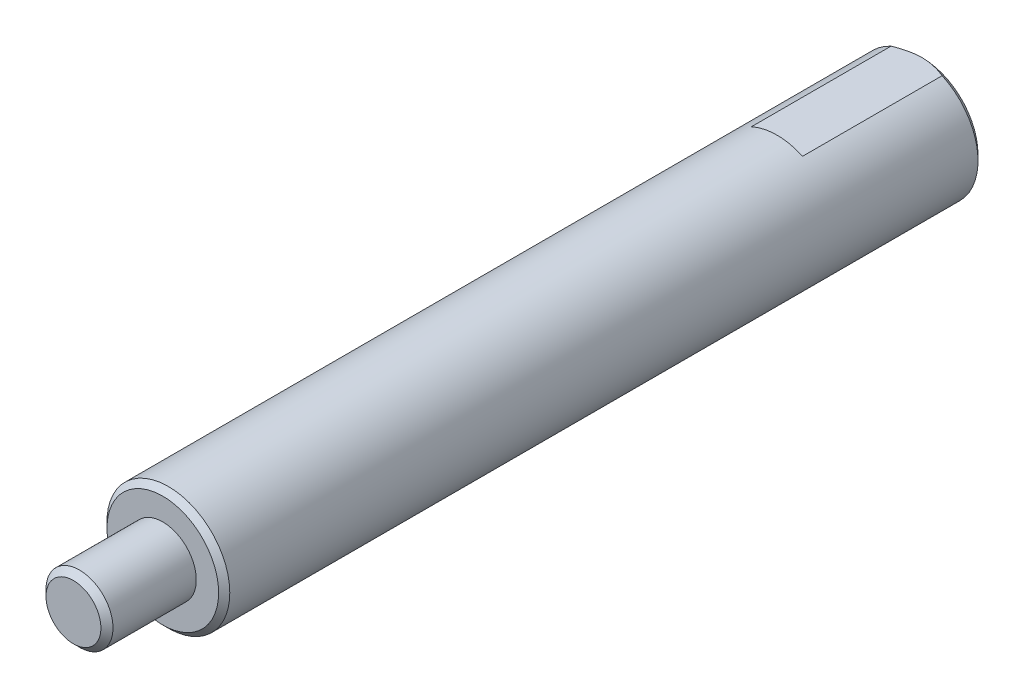
ISO-10303-21;
HEADER;
FILE_DESCRIPTION(('STEP AP214'),'2;1');
FILE_NAME('part.step','',(''),(''),'','','');
FILE_SCHEMA(('AUTOMOTIVE_DESIGN { 1 0 10303 214 1 1 1 1 }'));
ENDSEC;
DATA;
#1=APPLICATION_CONTEXT('core data for automotive mechanical design processes');
#2=APPLICATION_PROTOCOL_DEFINITION('international standard','automotive_design',2000,#1);
#3=PRODUCT_CONTEXT('',#1,'mechanical');
#4=PRODUCT('Part','Part','',(#3));
#5=PRODUCT_RELATED_PRODUCT_CATEGORY('part','',(#4));
#6=PRODUCT_DEFINITION_FORMATION('','',#4);
#7=PRODUCT_DEFINITION_CONTEXT('part definition',#1,'design');
#8=PRODUCT_DEFINITION('design','',#6,#7);
#9=PRODUCT_DEFINITION_SHAPE('','',#8);
#10=(LENGTH_UNIT() NAMED_UNIT(*) SI_UNIT(.MILLI.,.METRE.));
#11=(NAMED_UNIT(*) PLANE_ANGLE_UNIT() SI_UNIT($,.RADIAN.));
#12=(NAMED_UNIT(*) SI_UNIT($,.STERADIAN.) SOLID_ANGLE_UNIT());
#13=UNCERTAINTY_MEASURE_WITH_UNIT(LENGTH_MEASURE(1.E-05),#10,'distance_accuracy_value','');
#14=(GEOMETRIC_REPRESENTATION_CONTEXT(3) GLOBAL_UNCERTAINTY_ASSIGNED_CONTEXT((#13)) GLOBAL_UNIT_ASSIGNED_CONTEXT((#10,
#11,#12)) REPRESENTATION_CONTEXT('',''));
#15=CARTESIAN_POINT('',(0.,0.,0.));
#16=DIRECTION('',(0.,0.,1.));
#17=DIRECTION('',(1.,0.,0.));
#18=AXIS2_PLACEMENT_3D('',#15,#16,#17);
#19=CARTESIAN_POINT('',(0.,0.,0.5));
#20=DIRECTION('',(0.,0.,1.));
#21=DIRECTION('',(1.,0.,0.));
#22=AXIS2_PLACEMENT_3D('',#19,#20,#21);
#23=CONICAL_SURFACE('',#22,5.5,0.785398163397457);
#24=CARTESIAN_POINT('',(14.6848091307527,5.,10.5126921972504));
#25=CARTESIAN_POINT('',(14.4453208226169,5.,10.2859896541326));
#26=CARTESIAN_POINT('',(14.2055496886512,5.,10.0595855916861));
#27=CARTESIAN_POINT('',(13.7253433237667,5.,9.60748006149906));
#28=CARTESIAN_POINT('',(13.4849080888775,5.,9.38177859797622));
#29=CARTESIAN_POINT('',(12.7618962256916,5.,8.70536049882658));
#30=CARTESIAN_POINT('',(12.2781765081116,5.,8.25586410270802));
#31=CARTESIAN_POINT('',(11.285520275484,5.,7.34194274282295));
#32=CARTESIAN_POINT('',(10.7764003173808,5.,6.87771631839147));
#33=CARTESIAN_POINT('',(10.0081237078526,5.,6.18705169530893));
#34=CARTESIAN_POINT('',(9.75140731219676,5.,5.95789999795166));
#35=CARTESIAN_POINT('',(9.23598125315539,5.,5.50185127115898));
#36=CARTESIAN_POINT('',(8.97727160895973,5.,5.27495422006515));
#37=CARTESIAN_POINT('',(8.45777334373333,5.,4.82431921159364));
#38=CARTESIAN_POINT('',(8.19698831207968,5.,4.60057712329841));
#39=CARTESIAN_POINT('',(7.6723358301828,5.,4.15670009726197));
#40=CARTESIAN_POINT('',(7.4084682157494,5.,3.93656535317604));
#41=CARTESIAN_POINT('',(6.87588577364976,5.,3.50025684420232));
#42=CARTESIAN_POINT('',(6.60715699098736,5.,3.28410005066106));
#43=CARTESIAN_POINT('',(6.06467897085506,5.,2.85824880719012));
#44=CARTESIAN_POINT('',(5.79093054202075,5.,2.64855333071791));
#45=CARTESIAN_POINT('',(5.24247824545979,5.,2.24225256251792));
#46=CARTESIAN_POINT('',(4.96790940819435,5.,2.04546689887257));
#47=CARTESIAN_POINT('',(4.54965992503172,5.,1.7593740597509));
#48=CARTESIAN_POINT('',(4.40911425501469,5.,1.66548481679897));
#49=CARTESIAN_POINT('',(4.12560555295639,5.,1.48143277641831));
#50=CARTESIAN_POINT('',(3.98264266122826,5.,1.39126976373138));
#51=CARTESIAN_POINT('',(3.69483138879447,5.,1.21601413329321));
#52=CARTESIAN_POINT('',(3.54999993591857,5.,1.13089382459595));
#53=CARTESIAN_POINT('',(3.25720950323672,5.,0.96613475049896));
#54=CARTESIAN_POINT('',(3.10925012756169,5.,0.886496684424973));
#55=CARTESIAN_POINT('',(2.81011276522673,5.,0.734125373534712));
#56=CARTESIAN_POINT('',(2.65894061859038,5.,0.661380726321601));
#57=CARTESIAN_POINT('',(2.35286256329051,5.,0.524242686166179));
#58=CARTESIAN_POINT('',(2.19795788752428,5.,0.459846579258794));
#59=CARTESIAN_POINT('',(1.96757107505026,5.,0.372774300731281));
#60=CARTESIAN_POINT('',(1.89359074216658,5.,0.346101437024846));
#61=CARTESIAN_POINT('',(1.74478391072042,5.,0.295222264195086));
#62=CARTESIAN_POINT('',(1.66995737392907,5.,0.271016067006701));
#63=CARTESIAN_POINT('',(1.44419485912727,5.,0.202417832217193));
#64=CARTESIAN_POINT('',(1.29200049197909,5.,0.162055560028204));
#65=CARTESIAN_POINT('',(0.985646477349276,5.,0.0940487123556825));
#66=CARTESIAN_POINT('',(0.831502220582615,5.,0.0663354854095938));
#67=CARTESIAN_POINT('',(0.521341182896939,5.,0.0247588689838233));
#68=CARTESIAN_POINT('',(0.365324622092967,5.,0.0108938672889534));
#69=CARTESIAN_POINT('',(0.0516160098073081,5.,-0.00220571628048262));
#70=CARTESIAN_POINT('',(-0.106080254029489,5.,-0.00134130349865995));
#71=CARTESIAN_POINT('',(-0.420679844238093,5.,0.015205502727523));
#72=CARTESIAN_POINT('',(-0.577583163483296,5.,0.0308880291126693));
#73=CARTESIAN_POINT('',(-0.890071145811355,5.,0.0762385891218637));
#74=CARTESIAN_POINT('',(-1.04564624986807,5.,0.105971488681488));
#75=CARTESIAN_POINT('',(-1.35387421816574,5.,0.177884717281074));
#76=CARTESIAN_POINT('',(-1.50652647420601,5.,0.220067607636138));
#77=CARTESIAN_POINT('',(-1.89899228144063,5.,0.343556358459226));
#78=CARTESIAN_POINT('',(-2.13618939052799,5.,0.433155135839447));
#79=CARTESIAN_POINT('',(-2.6019239710927,5.,0.632544932175611));
#80=CARTESIAN_POINT('',(-2.83045405488705,5.,0.742352730382571));
#81=CARTESIAN_POINT('',(-3.16847602424751,5.,0.918609391765351));
#82=CARTESIAN_POINT('',(-3.2808721724946,5.,0.979600606049572));
#83=CARTESIAN_POINT('',(-3.50386518493618,5.,1.10479681410015));
#84=CARTESIAN_POINT('',(-3.61446202600304,5.,1.16900184913261));
#85=CARTESIAN_POINT('',(-3.83396126584146,5.,1.30012039469583));
#86=CARTESIAN_POINT('',(-3.94286443721393,5.,1.36703261693928));
#87=CARTESIAN_POINT('',(-4.15918024646913,5.,1.50320934076179));
#88=CARTESIAN_POINT('',(-4.26659294268127,5.,1.57247374992073));
#89=CARTESIAN_POINT('',(-4.62241235734337,5.,1.80671898738903));
#90=CARTESIAN_POINT('',(-4.8678658700884,5.,1.97619150842323));
#91=CARTESIAN_POINT('',(-5.35312692377588,5.,2.32306349681903));
#92=CARTESIAN_POINT('',(-5.5929332207239,5.,2.50046468625888));
#93=CARTESIAN_POINT('',(-6.06824445724728,5.,2.86127560728381));
#94=CARTESIAN_POINT('',(-6.30374612411163,5.,3.04468963665758));
#95=CARTESIAN_POINT('',(-6.77116765089348,5.,3.41597165684284));
#96=CARTESIAN_POINT('',(-7.00308779793956,5.,3.603839287518));
#97=CARTESIAN_POINT('',(-7.46479831203303,5.,3.98364854892032));
#98=CARTESIAN_POINT('',(-7.69457957218859,5.,4.17560122632358));
#99=CARTESIAN_POINT('',(-8.15180534086184,5.,4.56227258082269));
#100=CARTESIAN_POINT('',(-8.37924980937898,5.,4.7569913051315));
#101=CARTESIAN_POINT('',(-8.83212152767335,5.,5.14856830192789));
#102=CARTESIAN_POINT('',(-9.05754957794687,5.,5.34542564979244));
#103=CARTESIAN_POINT('',(-9.50680949169888,5.,5.74095449633208));
#104=CARTESIAN_POINT('',(-9.73064134364113,5.,5.93962600809511));
#105=CARTESIAN_POINT('',(-10.3554269609871,5.,6.49792304019967));
#106=CARTESIAN_POINT('',(-10.7548894567921,5.,6.85921712232008));
#107=CARTESIAN_POINT('',(-11.5506520435192,5.,7.58535654201278));
#108=CARTESIAN_POINT('',(-11.9469517546505,5.,7.95020229473568));
#109=CARTESIAN_POINT('',(-12.7346046209229,5.,8.6802168794551));
#110=CARTESIAN_POINT('',(-13.1259732089033,5.,9.04536907885113));
#111=CARTESIAN_POINT('',(-13.9067337252459,5.,9.77766414097997));
#112=CARTESIAN_POINT('',(-14.2961259422761,5.,10.1448066957958));
#113=CARTESIAN_POINT('',(-14.6848091307527,5.,10.5126921972504));
#114=B_SPLINE_CURVE_WITH_KNOTS('',3,(#24,#25,#26,#27,#28,#29,#30,#31,#32,#33,#34,#35,#36,#37,
#38,#39,#40,#41,#42,#43,#44,#45,#46,#47,#48,#49,#50,#51,#52,#53,#54,#55,#56,#57,#58,#59,#60,#61,
#62,#63,#64,#65,#66,#67,#68,#69,#70,#71,#72,#73,#74,#75,#76,#77,#78,#79,#80,#81,#82,#83,#84,#85,
#86,#87,#88,#89,#90,#91,#92,#93,#94,#95,#96,#97,#98,#99,#100,#101,#102,#103,#104,#105,#106,#107,
#108,#109,#110,#111,#112,#113),.UNSPECIFIED.,.F.,.F.,(4,2,2,2,2,2,2,2,2,2,2,2,2,2,2,2,2,2,2,2,2,
2,2,2,2,2,2,2,2,2,2,2,2,2,2,2,2,2,2,2,2,2,2,2,4),(0.,0.989311923310725,1.97862977419094,
3.95959337600449,6.02651317448664,7.05884240046679,8.09116170015323,9.12197286482435,
10.1528391870695,11.1873903696084,12.2217763312281,13.2349233326135,13.7419424161501,
14.2489321689687,14.7528143978999,15.2567607843972,15.7598584856993,16.2627922263957,
16.4986794127495,16.7345772986731,17.2064516788898,17.6757336299656,18.1449609407033,
18.6173431093421,19.0897295160002,19.5643184047905,20.0390049980712,20.798297788604,
21.5582238763949,21.9418160729224,22.325413196115,22.7088298733657,23.0922315031285,
23.9868071792125,24.8815781072262,25.7770031658052,26.6723560620085,27.5705534283766,
28.4687661443111,29.3666048627684,30.2644500636282,31.8802558929104,33.4962529155446,
35.1020309687601,36.707567313143),.UNSPECIFIED.);
#115=CARTESIAN_POINT('',(2.29128784747799,5.,0.499999999999981));
#116=VERTEX_POINT('',#115);
#117=CARTESIAN_POINT('',(0.,4.99999999999999,0.));
#118=VERTEX_POINT('',#117);
#119=EDGE_CURVE('E54',#116,#118,#114,.T.);
#120=ORIENTED_EDGE('',*,*,#119,.F.);
#121=CARTESIAN_POINT('',(0.,0.,0.5));
#122=DIRECTION('',(0.,0.,1.));
#123=DIRECTION('',(1.,0.,0.));
#124=AXIS2_PLACEMENT_3D('',#121,#122,#123);
#125=CIRCLE('',#124,5.5);
#126=CARTESIAN_POINT('',(2.29128784747792,-5.,0.5));
#127=VERTEX_POINT('',#126);
#128=EDGE_CURVE('E123',#127,#116,#125,.T.);
#129=ORIENTED_EDGE('',*,*,#128,.F.);
#130=CARTESIAN_POINT('',(-14.6848091307527,-5.,10.5126921972504));
#131=CARTESIAN_POINT('',(-14.4453208226169,-5.,10.2859896541325));
#132=CARTESIAN_POINT('',(-14.2055496886512,-5.,10.0595855916861));
#133=CARTESIAN_POINT('',(-13.7253433237667,-5.,9.60748006149906));
#134=CARTESIAN_POINT('',(-13.4849080888775,-5.,9.38177859797621));
#135=CARTESIAN_POINT('',(-12.7618962256916,-5.,8.70536049882658));
#136=CARTESIAN_POINT('',(-12.2781765081116,-5.,8.25586410270802));
#137=CARTESIAN_POINT('',(-11.285520275484,-5.,7.34194274282294));
#138=CARTESIAN_POINT('',(-10.7764003173808,-5.,6.87771631839147));
#139=CARTESIAN_POINT('',(-10.0081237078526,-5.,6.18705169530893));
#140=CARTESIAN_POINT('',(-9.75140731219676,-5.,5.95789999795166));
#141=CARTESIAN_POINT('',(-9.23598125315539,-5.,5.50185127115898));
#142=CARTESIAN_POINT('',(-8.97727160895972,-5.,5.27495422006515));
#143=CARTESIAN_POINT('',(-8.45777334373333,-5.,4.82431921159363));
#144=CARTESIAN_POINT('',(-8.19698831207968,-5.,4.60057712329841));
#145=CARTESIAN_POINT('',(-7.67233583018279,-5.,4.15670009726197));
#146=CARTESIAN_POINT('',(-7.4084682157494,-5.,3.93656535317604));
#147=CARTESIAN_POINT('',(-6.87588577364976,-5.,3.50025684420232));
#148=CARTESIAN_POINT('',(-6.60715699098736,-5.,3.28410005066106));
#149=CARTESIAN_POINT('',(-6.06467897085506,-5.,2.85824880719012));
#150=CARTESIAN_POINT('',(-5.79093054202075,-5.,2.64855333071791));
#151=CARTESIAN_POINT('',(-5.24247824545979,-5.,2.24225256251792));
#152=CARTESIAN_POINT('',(-4.96790940819436,-5.,2.04546689887257));
#153=CARTESIAN_POINT('',(-4.54965992503172,-5.,1.7593740597509));
#154=CARTESIAN_POINT('',(-4.40911425501469,-5.,1.66548481679897));
#155=CARTESIAN_POINT('',(-4.12560555295639,-5.,1.48143277641831));
#156=CARTESIAN_POINT('',(-3.98264266122826,-5.,1.39126976373138));
#157=CARTESIAN_POINT('',(-3.69483138879447,-5.,1.21601413329321));
#158=CARTESIAN_POINT('',(-3.54999993591857,-5.,1.13089382459595));
#159=CARTESIAN_POINT('',(-3.25720950323672,-5.,0.96613475049896));
#160=CARTESIAN_POINT('',(-3.10925012756169,-5.,0.886496684424973));
#161=CARTESIAN_POINT('',(-2.81011276522673,-5.,0.734125373534712));
#162=CARTESIAN_POINT('',(-2.65894061859038,-5.,0.661380726321601));
#163=CARTESIAN_POINT('',(-2.35286256329051,-5.,0.524242686166179));
#164=CARTESIAN_POINT('',(-2.19795788752428,-5.,0.459846579258795));
#165=CARTESIAN_POINT('',(-1.96757107505027,-5.,0.372774300731282));
#166=CARTESIAN_POINT('',(-1.89359074216658,-5.,0.346101437024846));
#167=CARTESIAN_POINT('',(-1.74478391072042,-5.,0.295222264195086));
#168=CARTESIAN_POINT('',(-1.66995737392907,-5.,0.271016067006701));
#169=CARTESIAN_POINT('',(-1.44419485912727,-5.,0.202417832217193));
#170=CARTESIAN_POINT('',(-1.29200049197909,-5.,0.162055560028204));
#171=CARTESIAN_POINT('',(-0.985646477349277,-5.,0.0940487123556828));
#172=CARTESIAN_POINT('',(-0.831502220582616,-5.,0.0663354854095948));
#173=CARTESIAN_POINT('',(-0.52134118289694,-5.,0.0247588689838242));
#174=CARTESIAN_POINT('',(-0.365324622092969,-5.,0.0108938672889537));
#175=CARTESIAN_POINT('',(-0.0516160098073107,-5.,-0.00220571628048288));
#176=CARTESIAN_POINT('',(0.106080254029486,-5.,-0.00134130349866004));
#177=CARTESIAN_POINT('',(0.42067984423809,-5.,0.0152055027275231));
#178=CARTESIAN_POINT('',(0.577583163483293,-5.,0.0308880291126695));
#179=CARTESIAN_POINT('',(0.890071145811352,-5.,0.0762385891218634));
#180=CARTESIAN_POINT('',(1.04564624986807,-5.,0.105971488681487));
#181=CARTESIAN_POINT('',(1.35387421816574,-5.,0.177884717281073));
#182=CARTESIAN_POINT('',(1.50652647420601,-5.,0.220067607636137));
#183=CARTESIAN_POINT('',(1.89899228144063,-5.,0.343556358459226));
#184=CARTESIAN_POINT('',(2.13618939052798,-5.,0.433155135839446));
#185=CARTESIAN_POINT('',(2.60192397109269,-5.,0.632544932175609));
#186=CARTESIAN_POINT('',(2.83045405488705,-5.,0.742352730382567));
#187=CARTESIAN_POINT('',(3.1684760242475,-5.,0.918609391765348));
#188=CARTESIAN_POINT('',(3.28087217249459,-5.,0.97960060604957));
#189=CARTESIAN_POINT('',(3.50386518493617,-5.,1.10479681410015));
#190=CARTESIAN_POINT('',(3.61446202600303,-5.,1.16900184913261));
#191=CARTESIAN_POINT('',(3.83396126584145,-5.,1.30012039469583));
#192=CARTESIAN_POINT('',(3.94286443721392,-5.,1.36703261693928));
#193=CARTESIAN_POINT('',(4.15918024646912,-5.,1.50320934076178));
#194=CARTESIAN_POINT('',(4.26659294268127,-5.,1.57247374992073));
#195=CARTESIAN_POINT('',(4.62241235734336,-5.,1.80671898738902));
#196=CARTESIAN_POINT('',(4.86786587008839,-5.,1.97619150842322));
#197=CARTESIAN_POINT('',(5.35312692377587,-5.,2.32306349681902));
#198=CARTESIAN_POINT('',(5.59293322072389,-5.,2.50046468625887));
#199=CARTESIAN_POINT('',(6.06824445724727,-5.,2.86127560728381));
#200=CARTESIAN_POINT('',(6.30374612411162,-5.,3.04468963665757));
#201=CARTESIAN_POINT('',(6.77116765089347,-5.,3.41597165684283));
#202=CARTESIAN_POINT('',(7.00308779793955,-5.,3.60383928751799));
#203=CARTESIAN_POINT('',(7.46479831203302,-5.,3.98364854892032));
#204=CARTESIAN_POINT('',(7.69457957218858,-5.,4.17560122632357));
#205=CARTESIAN_POINT('',(8.15180534086183,-5.,4.56227258082269));
#206=CARTESIAN_POINT('',(8.37924980937897,-5.,4.75699130513149));
#207=CARTESIAN_POINT('',(8.83212152767334,-5.,5.14856830192789));
#208=CARTESIAN_POINT('',(9.05754957794686,-5.,5.34542564979243));
#209=CARTESIAN_POINT('',(9.50680949169887,-5.,5.74095449633208));
#210=CARTESIAN_POINT('',(9.73064134364113,-5.,5.9396260080951));
#211=CARTESIAN_POINT('',(10.355426960987,-5.,6.49792304019967));
#212=CARTESIAN_POINT('',(10.7548894567921,-5.,6.85921712232007));
#213=CARTESIAN_POINT('',(11.5506520435192,-5.,7.58535654201278));
#214=CARTESIAN_POINT('',(11.9469517546505,-5.,7.95020229473567));
#215=CARTESIAN_POINT('',(12.7346046209229,-5.,8.6802168794551));
#216=CARTESIAN_POINT('',(13.1259732089033,-5.,9.04536907885113));
#217=CARTESIAN_POINT('',(13.9067337252459,-5.,9.77766414097997));
#218=CARTESIAN_POINT('',(14.2961259422761,-5.,10.1448066957958));
#219=CARTESIAN_POINT('',(14.6848091307527,-5.,10.5126921972504));
#220=B_SPLINE_CURVE_WITH_KNOTS('',3,(#130,#131,#132,#133,#134,#135,#136,#137,#138,#139,#140,
#141,#142,#143,#144,#145,#146,#147,#148,#149,#150,#151,#152,#153,#154,#155,#156,#157,#158,#159,
#160,#161,#162,#163,#164,#165,#166,#167,#168,#169,#170,#171,#172,#173,#174,#175,#176,#177,#178,
#179,#180,#181,#182,#183,#184,#185,#186,#187,#188,#189,#190,#191,#192,#193,#194,#195,#196,#197,
#198,#199,#200,#201,#202,#203,#204,#205,#206,#207,#208,#209,#210,#211,#212,#213,#214,#215,#216,
#217,#218,#219),.UNSPECIFIED.,.F.,.F.,(4,2,2,2,2,2,2,2,2,2,2,2,2,2,2,2,2,2,2,2,2,2,2,2,2,2,2,2,
2,2,2,2,2,2,2,2,2,2,2,2,2,2,2,2,4),(0.,0.989311923310724,1.97862977419094,3.95959337600449,
6.02651317448663,7.05884240046678,8.09116170015323,9.12197286482434,10.1528391870695,
11.1873903696084,12.2217763312281,13.2349233326135,13.7419424161501,14.2489321689687,
14.7528143978999,15.2567607843972,15.7598584856993,16.2627922263957,16.4986794127495,
16.7345772986731,17.2064516788898,17.6757336299656,18.1449609407033,18.6173431093421,
19.0897295160002,19.5643184047905,20.0390049980712,20.798297788604,21.5582238763948,
21.9418160729224,22.325413196115,22.7088298733657,23.0922315031285,23.9868071792125,
24.8815781072262,25.7770031658052,26.6723560620085,27.5705534283765,28.468766144311,
29.3666048627684,30.2644500636281,31.8802558929104,33.4962529155446,35.10203096876,
36.7075673131429),.UNSPECIFIED.);
#221=CARTESIAN_POINT('',(0.,-4.99999999999999,0.));
#222=VERTEX_POINT('',#221);
#223=EDGE_CURVE('E139',#222,#127,#220,.T.);
#224=ORIENTED_EDGE('',*,*,#223,.F.);
#225=CARTESIAN_POINT('',(0.,0.,0.));
#226=DIRECTION('',(0.,0.,1.));
#227=DIRECTION('',(1.,0.,0.));
#228=AXIS2_PLACEMENT_3D('',#225,#226,#227);
#229=CIRCLE('',#228,4.99999999999999);
#230=EDGE_CURVE('E130',#118,#222,#229,.F.);
#231=ORIENTED_EDGE('',*,*,#230,.F.);
#232=EDGE_LOOP('',(#120,#129,#224,#231));
#233=FACE_BOUND('',#232,.T.);
#234=ADVANCED_FACE('F39',(#233),#23,.T.);
#235=CARTESIAN_POINT('',(0.,0.,68.));
#236=DIRECTION('',(0.,0.,1.));
#237=DIRECTION('',(1.,0.,0.));
#238=AXIS2_PLACEMENT_3D('',#235,#236,#237);
#239=PLANE('',#238);
#240=CARTESIAN_POINT('',(0.,0.,68.));
#241=DIRECTION('',(0.,0.,1.));
#242=DIRECTION('',(1.,0.,0.));
#243=AXIS2_PLACEMENT_3D('',#240,#241,#242);
#244=CIRCLE('',#243,5.);
#245=CARTESIAN_POINT('',(5.,0.,68.));
#246=VERTEX_POINT('',#245);
#247=EDGE_CURVE('E129',#246,#246,#244,.T.);
#248=ORIENTED_EDGE('',*,*,#247,.T.);
#249=EDGE_LOOP('',(#248));
#250=FACE_BOUND('',#249,.T.);
#251=CARTESIAN_POINT('',(0.,0.,68.));
#252=DIRECTION('',(0.,0.,-1.));
#253=DIRECTION('',(-1.,0.,0.));
#254=AXIS2_PLACEMENT_3D('',#251,#252,#253);
#255=CIRCLE('',#254,3.);
#256=CARTESIAN_POINT('',(-3.,0.,68.));
#257=VERTEX_POINT('',#256);
#258=EDGE_CURVE('E98',#257,#257,#255,.T.);
#259=ORIENTED_EDGE('',*,*,#258,.T.);
#260=EDGE_LOOP('',(#259));
#261=FACE_BOUND('',#260,.T.);
#262=ADVANCED_FACE('F175',(#250,#261),#239,.T.);
#263=CARTESIAN_POINT('',(0.,0.,68.));
#264=DIRECTION('',(0.,0.,-1.));
#265=DIRECTION('',(-1.,0.,0.));
#266=AXIS2_PLACEMENT_3D('',#263,#264,#265);
#267=CYLINDRICAL_SURFACE('',#266,5.5);
#268=CARTESIAN_POINT('',(0.,0.,13.));
#269=DIRECTION('',(0.,0.,-1.));
#270=DIRECTION('',(-1.,0.,0.));
#271=AXIS2_PLACEMENT_3D('',#268,#269,#270);
#272=CIRCLE('',#271,5.5);
#273=CARTESIAN_POINT('',(-2.29128784747792,5.,13.));
#274=VERTEX_POINT('',#273);
#275=CARTESIAN_POINT('',(2.29128784747792,5.,13.));
#276=VERTEX_POINT('',#275);
#277=EDGE_CURVE('E11',#274,#276,#272,.T.);
#278=ORIENTED_EDGE('',*,*,#277,.F.);
#279=DIRECTION('',(0.,0.,-1.));
#280=VECTOR('',#279,1.);
#281=CARTESIAN_POINT('',(-2.29128784747792,5.,68.));
#282=LINE('',#281,#280);
#283=CARTESIAN_POINT('',(-2.29128784747792,5.,0.5));
#284=VERTEX_POINT('',#283);
#285=EDGE_CURVE('E115',#274,#284,#282,.T.);
#286=ORIENTED_EDGE('',*,*,#285,.T.);
#287=CARTESIAN_POINT('',(-2.29128784747799,-5.,0.499999999999981));
#288=VERTEX_POINT('',#287);
#289=EDGE_CURVE('E106',#284,#288,#125,.T.);
#290=ORIENTED_EDGE('',*,*,#289,.T.);
#291=DIRECTION('',(0.,0.,-1.));
#292=VECTOR('',#291,1.);
#293=CARTESIAN_POINT('',(-2.29128784747792,-5.,68.));
#294=LINE('',#293,#292);
#295=CARTESIAN_POINT('',(-2.29128784747792,-5.,13.));
#296=VERTEX_POINT('',#295);
#297=EDGE_CURVE('E95',#288,#296,#294,.F.);
#298=ORIENTED_EDGE('',*,*,#297,.T.);
#299=CARTESIAN_POINT('',(0.,0.,13.));
#300=DIRECTION('',(0.,0.,1.));
#301=DIRECTION('',(1.,0.,0.));
#302=AXIS2_PLACEMENT_3D('',#299,#300,#301);
#303=CIRCLE('',#302,5.5);
#304=CARTESIAN_POINT('',(2.29128784747792,-5.,13.));
#305=VERTEX_POINT('',#304);
#306=EDGE_CURVE('E47',#296,#305,#303,.T.);
#307=ORIENTED_EDGE('',*,*,#306,.T.);
#308=DIRECTION('',(0.,0.,-1.));
#309=VECTOR('',#308,1.);
#310=CARTESIAN_POINT('',(2.29128784747792,-5.,68.));
#311=LINE('',#310,#309);
#312=EDGE_CURVE('E96',#305,#127,#311,.T.);
#313=ORIENTED_EDGE('',*,*,#312,.T.);
#314=ORIENTED_EDGE('',*,*,#128,.T.);
#315=DIRECTION('',(0.,0.,-1.));
#316=VECTOR('',#315,1.);
#317=CARTESIAN_POINT('',(2.29128784747792,5.,68.));
#318=LINE('',#317,#316);
#319=EDGE_CURVE('E108',#116,#276,#318,.F.);
#320=ORIENTED_EDGE('',*,*,#319,.T.);
#321=EDGE_LOOP('',(#278,#286,#290,#298,#307,#313,#314,#320));
#322=FACE_BOUND('',#321,.T.);
#323=CARTESIAN_POINT('',(0.,0.,67.5));
#324=DIRECTION('',(0.,0.,1.));
#325=DIRECTION('',(1.,0.,0.));
#326=AXIS2_PLACEMENT_3D('',#323,#324,#325);
#327=CIRCLE('',#326,5.5);
#328=CARTESIAN_POINT('',(5.5,0.,67.5));
#329=VERTEX_POINT('',#328);
#330=EDGE_CURVE('E120',#329,#329,#327,.F.);
#331=ORIENTED_EDGE('',*,*,#330,.T.);
#332=EDGE_LOOP('',(#331));
#333=FACE_BOUND('',#332,.T.);
#334=ADVANCED_FACE('F102',(#322,#333),#267,.T.);
#335=CARTESIAN_POINT('',(0.,0.,0.));
#336=DIRECTION('',(0.,0.,1.));
#337=DIRECTION('',(1.,0.,0.));
#338=AXIS2_PLACEMENT_3D('',#335,#336,#337);
#339=PLANE('',#338);
#340=CARTESIAN_POINT('',(0.,0.,0.));
#341=DIRECTION('',(0.,0.,1.));
#342=DIRECTION('',(1.,0.,0.));
#343=AXIS2_PLACEMENT_3D('',#340,#341,#342);
#344=CIRCLE('',#343,2.59999999999999);
#345=CARTESIAN_POINT('',(2.59999999999999,0.,0.));
#346=VERTEX_POINT('',#345);
#347=EDGE_CURVE('E136',#346,#346,#344,.T.);
#348=ORIENTED_EDGE('',*,*,#347,.T.);
#349=EDGE_LOOP('',(#348));
#350=FACE_BOUND('',#349,.T.);
#351=EDGE_CURVE('E126',#222,#118,#229,.F.);
#352=ORIENTED_EDGE('',*,*,#351,.T.);
#353=ORIENTED_EDGE('',*,*,#230,.T.);
#354=EDGE_LOOP('',(#352,#353));
#355=FACE_BOUND('',#354,.T.);
#356=ADVANCED_FACE('F179',(#350,#355),#339,.F.);
#357=EDGE_CURVE('E147',#118,#284,#114,.T.);
#358=ORIENTED_EDGE('',*,*,#357,.F.);
#359=ORIENTED_EDGE('',*,*,#351,.F.);
#360=EDGE_CURVE('E62',#288,#222,#220,.T.);
#361=ORIENTED_EDGE('',*,*,#360,.F.);
#362=ORIENTED_EDGE('',*,*,#289,.F.);
#363=EDGE_LOOP('',(#358,#359,#361,#362));
#364=FACE_BOUND('',#363,.T.);
#365=ADVANCED_FACE('F153',(#364),#23,.T.);
#366=CARTESIAN_POINT('',(0.,0.,68.));
#367=DIRECTION('',(0.,0.,-1.));
#368=DIRECTION('',(-1.,0.,0.));
#369=AXIS2_PLACEMENT_3D('',#366,#367,#368);
#370=CONICAL_SURFACE('',#369,5.,0.785398163397457);
#371=ORIENTED_EDGE('',*,*,#330,.F.);
#372=EDGE_LOOP('',(#371));
#373=FACE_BOUND('',#372,.T.);
#374=ORIENTED_EDGE('',*,*,#247,.F.);
#375=EDGE_LOOP('',(#374));
#376=FACE_BOUND('',#375,.T.);
#377=ADVANCED_FACE('F168',(#373,#376),#370,.T.);
#378=CARTESIAN_POINT('',(0.,0.,12.4));
#379=DIRECTION('',(0.,0.,-1.));
#380=DIRECTION('',(-1.,0.,0.));
#381=AXIS2_PLACEMENT_3D('',#378,#379,#380);
#382=CONICAL_SURFACE('',#381,2.1,1.02974425867665);
#383=CARTESIAN_POINT('',(0.,0.,13.6618072999579));
#384=VERTEX_POINT('',#383);
#385=VERTEX_LOOP('',#384);
#386=FACE_BOUND('',#385,.T.);
#387=CARTESIAN_POINT('',(0.,0.,12.4));
#388=DIRECTION('',(0.,0.,-1.));
#389=DIRECTION('',(-1.,0.,0.));
#390=AXIS2_PLACEMENT_3D('',#387,#388,#389);
#391=CIRCLE('',#390,2.1);
#392=CARTESIAN_POINT('',(-2.1,0.,12.4));
#393=VERTEX_POINT('',#392);
#394=EDGE_CURVE('E117',#393,#393,#391,.T.);
#395=ORIENTED_EDGE('',*,*,#394,.T.);
#396=EDGE_LOOP('',(#395));
#397=FACE_BOUND('',#396,.T.);
#398=ADVANCED_FACE('F164',(#386,#397),#382,.F.);
#399=CARTESIAN_POINT('',(0.,0.,0.));
#400=DIRECTION('',(0.,0.,-1.));
#401=DIRECTION('',(-1.,0.,0.));
#402=AXIS2_PLACEMENT_3D('',#399,#400,#401);
#403=CYLINDRICAL_SURFACE('',#402,2.1);
#404=CARTESIAN_POINT('',(0.,0.,0.499999999999993));
#405=DIRECTION('',(0.,0.,1.));
#406=DIRECTION('',(1.,0.,0.));
#407=AXIS2_PLACEMENT_3D('',#404,#405,#406);
#408=CIRCLE('',#407,2.1);
#409=CARTESIAN_POINT('',(2.1,0.,0.499999999999993));
#410=VERTEX_POINT('',#409);
#411=EDGE_CURVE('E133',#410,#410,#408,.F.);
#412=ORIENTED_EDGE('',*,*,#411,.T.);
#413=EDGE_LOOP('',(#412));
#414=FACE_BOUND('',#413,.T.);
#415=ORIENTED_EDGE('',*,*,#394,.F.);
#416=EDGE_LOOP('',(#415));
#417=FACE_BOUND('',#416,.T.);
#418=ADVANCED_FACE('F161',(#414,#417),#403,.F.);
#419=CARTESIAN_POINT('',(0.,0.,0.499999999999993));
#420=DIRECTION('',(0.,0.,-1.));
#421=DIRECTION('',(-1.,0.,0.));
#422=AXIS2_PLACEMENT_3D('',#419,#420,#421);
#423=CONICAL_SURFACE('',#422,2.1,0.785398163397448);
#424=ORIENTED_EDGE('',*,*,#347,.F.);
#425=EDGE_LOOP('',(#424));
#426=FACE_BOUND('',#425,.T.);
#427=ORIENTED_EDGE('',*,*,#411,.F.);
#428=EDGE_LOOP('',(#427));
#429=FACE_BOUND('',#428,.T.);
#430=ADVANCED_FACE('F41',(#426,#429),#423,.F.);
#431=CARTESIAN_POINT('',(0.,0.,13.));
#432=DIRECTION('',(0.,0.,1.));
#433=DIRECTION('',(1.,0.,0.));
#434=AXIS2_PLACEMENT_3D('',#431,#432,#433);
#435=PLANE('',#434);
#436=DIRECTION('',(1.,0.,0.));
#437=VECTOR('',#436,1.);
#438=CARTESIAN_POINT('',(5.,-5.,13.));
#439=LINE('',#438,#437);
#440=EDGE_CURVE('E90',#296,#305,#439,.T.);
#441=ORIENTED_EDGE('',*,*,#440,.T.);
#442=ORIENTED_EDGE('',*,*,#306,.F.);
#443=EDGE_LOOP('',(#441,#442));
#444=FACE_BOUND('',#443,.T.);
#445=ADVANCED_FACE('F89',(#444),#435,.F.);
#446=CARTESIAN_POINT('',(5.,-5.,13.));
#447=DIRECTION('',(0.,1.,0.));
#448=DIRECTION('',(0.,0.,1.));
#449=AXIS2_PLACEMENT_3D('',#446,#447,#448);
#450=PLANE('',#449);
#451=ORIENTED_EDGE('',*,*,#440,.F.);
#452=ORIENTED_EDGE('',*,*,#297,.F.);
#453=ORIENTED_EDGE('',*,*,#360,.T.);
#454=ORIENTED_EDGE('',*,*,#223,.T.);
#455=ORIENTED_EDGE('',*,*,#312,.F.);
#456=EDGE_LOOP('',(#451,#452,#453,#454,#455));
#457=FACE_BOUND('',#456,.T.);
#458=ADVANCED_FACE('F94',(#457),#450,.F.);
#459=CARTESIAN_POINT('',(0.,0.,13.));
#460=DIRECTION('',(0.,0.,-1.));
#461=DIRECTION('',(-1.,0.,0.));
#462=AXIS2_PLACEMENT_3D('',#459,#460,#461);
#463=PLANE('',#462);
#464=ORIENTED_EDGE('',*,*,#277,.T.);
#465=DIRECTION('',(-1.,0.,0.));
#466=VECTOR('',#465,1.);
#467=CARTESIAN_POINT('',(5.,5.,13.));
#468=LINE('',#467,#466);
#469=EDGE_CURVE('E97',#276,#274,#468,.T.);
#470=ORIENTED_EDGE('',*,*,#469,.T.);
#471=EDGE_LOOP('',(#464,#470));
#472=FACE_BOUND('',#471,.T.);
#473=ADVANCED_FACE('F160',(#472),#463,.T.);
#474=CARTESIAN_POINT('',(5.,5.,13.));
#475=DIRECTION('',(0.,-1.,0.));
#476=DIRECTION('',(0.,0.,-1.));
#477=AXIS2_PLACEMENT_3D('',#474,#475,#476);
#478=PLANE('',#477);
#479=ORIENTED_EDGE('',*,*,#469,.F.);
#480=ORIENTED_EDGE('',*,*,#319,.F.);
#481=ORIENTED_EDGE('',*,*,#119,.T.);
#482=ORIENTED_EDGE('',*,*,#357,.T.);
#483=ORIENTED_EDGE('',*,*,#285,.F.);
#484=EDGE_LOOP('',(#479,#480,#481,#482,#483));
#485=FACE_BOUND('',#484,.T.);
#486=ADVANCED_FACE('F201',(#485),#478,.F.);
#487=CARTESIAN_POINT('',(0.,0.,76.));
#488=DIRECTION('',(0.,0.,-1.));
#489=DIRECTION('',(-1.,0.,0.));
#490=AXIS2_PLACEMENT_3D('',#487,#488,#489);
#491=CYLINDRICAL_SURFACE('',#490,3.);
#492=ORIENTED_EDGE('',*,*,#258,.F.);
#493=EDGE_LOOP('',(#492));
#494=FACE_BOUND('',#493,.T.);
#495=CARTESIAN_POINT('',(0.,0.,75.4585));
#496=DIRECTION('',(0.,0.,-1.));
#497=DIRECTION('',(-1.,0.,0.));
#498=AXIS2_PLACEMENT_3D('',#495,#496,#497);
#499=CIRCLE('',#498,3.);
#500=CARTESIAN_POINT('',(-3.,0.,75.4585));
#501=VERTEX_POINT('',#500);
#502=EDGE_CURVE('E221',#501,#501,#499,.T.);
#503=ORIENTED_EDGE('',*,*,#502,.T.);
#504=EDGE_LOOP('',(#503));
#505=FACE_BOUND('',#504,.T.);
#506=ADVANCED_FACE('F208',(#494,#505),#491,.T.);
#507=CARTESIAN_POINT('',(0.,0.,76.));
#508=DIRECTION('',(0.,0.,-1.));
#509=DIRECTION('',(-1.,0.,0.));
#510=AXIS2_PLACEMENT_3D('',#507,#508,#509);
#511=CONICAL_SURFACE('',#510,2.4585,0.785398163397448);
#512=ORIENTED_EDGE('',*,*,#502,.F.);
#513=EDGE_LOOP('',(#512));
#514=FACE_BOUND('',#513,.T.);
#515=CARTESIAN_POINT('',(0.,0.,76.));
#516=DIRECTION('',(0.,0.,-1.));
#517=DIRECTION('',(-1.,0.,0.));
#518=AXIS2_PLACEMENT_3D('',#515,#516,#517);
#519=CIRCLE('',#518,2.4585);
#520=CARTESIAN_POINT('',(-2.4585,0.,76.));
#521=VERTEX_POINT('',#520);
#522=EDGE_CURVE('E224',#521,#521,#519,.T.);
#523=ORIENTED_EDGE('',*,*,#522,.T.);
#524=EDGE_LOOP('',(#523));
#525=FACE_BOUND('',#524,.T.);
#526=ADVANCED_FACE('F173',(#514,#525),#511,.T.);
#527=CARTESIAN_POINT('',(0.,0.,76.));
#528=DIRECTION('',(0.,0.,1.));
#529=DIRECTION('',(1.,0.,0.));
#530=AXIS2_PLACEMENT_3D('',#527,#528,#529);
#531=PLANE('',#530);
#532=ORIENTED_EDGE('',*,*,#522,.F.);
#533=EDGE_LOOP('',(#532));
#534=FACE_BOUND('',#533,.T.);
#535=ADVANCED_FACE('F170',(#534),#531,.T.);
#536=CLOSED_SHELL('',(#234,#262,#334,#356,#365,#377,#398,#418,#430,#445,#458,#473,#486,#506,
#526,#535));
#537=MANIFOLD_SOLID_BREP('B2',#536);
#538=ADVANCED_BREP_SHAPE_REPRESENTATION('',(#18,#537),#14);
#539=SHAPE_DEFINITION_REPRESENTATION(#9,#538);
ENDSEC;
END-ISO-10303-21;
